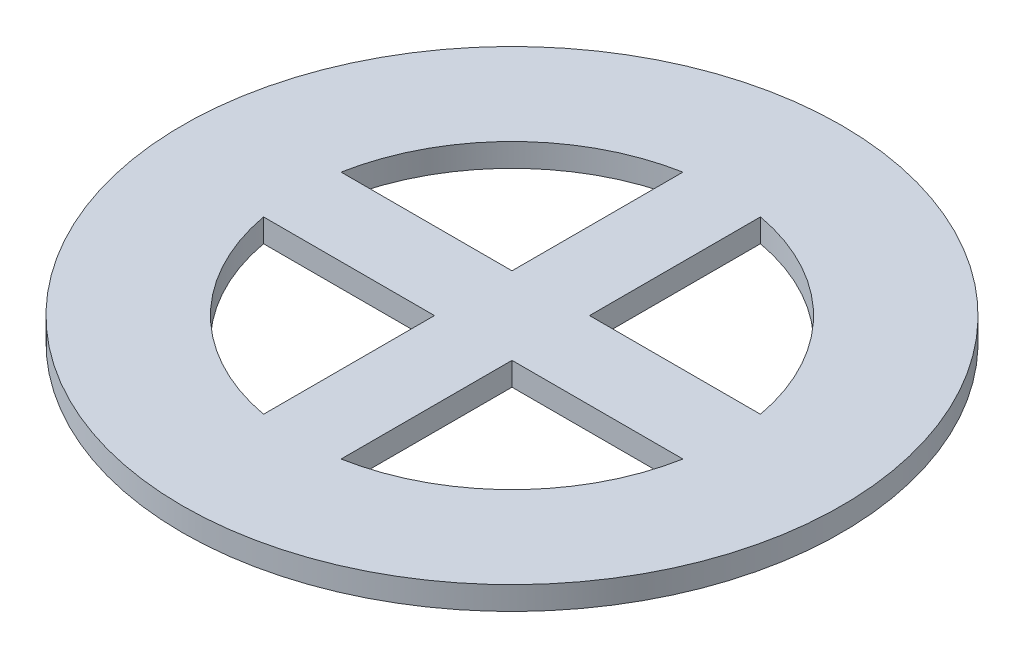
ISO-10303-21;
HEADER;
FILE_DESCRIPTION(('STEP AP214'),'2;1');
FILE_NAME('part.step','',(''),(''),'','','');
FILE_SCHEMA(('AUTOMOTIVE_DESIGN { 1 0 10303 214 1 1 1 1 }'));
ENDSEC;
DATA;
#1=APPLICATION_CONTEXT('core data for automotive mechanical design processes');
#2=APPLICATION_PROTOCOL_DEFINITION('international standard','automotive_design',2000,#1);
#3=PRODUCT_CONTEXT('',#1,'mechanical');
#4=PRODUCT('Part','Part','',(#3));
#5=PRODUCT_RELATED_PRODUCT_CATEGORY('part','',(#4));
#6=PRODUCT_DEFINITION_FORMATION('','',#4);
#7=PRODUCT_DEFINITION_CONTEXT('part definition',#1,'design');
#8=PRODUCT_DEFINITION('design','',#6,#7);
#9=PRODUCT_DEFINITION_SHAPE('','',#8);
#10=(LENGTH_UNIT() NAMED_UNIT(*) SI_UNIT(.MILLI.,.METRE.));
#11=(NAMED_UNIT(*) PLANE_ANGLE_UNIT() SI_UNIT($,.RADIAN.));
#12=(NAMED_UNIT(*) SI_UNIT($,.STERADIAN.) SOLID_ANGLE_UNIT());
#13=UNCERTAINTY_MEASURE_WITH_UNIT(LENGTH_MEASURE(1.E-05),#10,'distance_accuracy_value','');
#14=(GEOMETRIC_REPRESENTATION_CONTEXT(3) GLOBAL_UNCERTAINTY_ASSIGNED_CONTEXT((#13)) GLOBAL_UNIT_ASSIGNED_CONTEXT((#10,
#11,#12)) REPRESENTATION_CONTEXT('',''));
#15=CARTESIAN_POINT('',(0.,0.,0.));
#16=DIRECTION('',(0.,0.,1.));
#17=DIRECTION('',(1.,0.,0.));
#18=AXIS2_PLACEMENT_3D('',#15,#16,#17);
#19=CARTESIAN_POINT('',(-9.99999999999999,6.,0.));
#20=DIRECTION('',(1.,0.,0.));
#21=DIRECTION('',(0.,0.,-1.));
#22=AXIS2_PLACEMENT_3D('',#19,#20,#21);
#23=PLANE('',#22);
#24=DIRECTION('',(0.,0.,1.));
#25=VECTOR('',#24,1.);
#26=CARTESIAN_POINT('',(-9.99999999999999,0.,0.));
#27=LINE('',#26,#25);
#28=CARTESIAN_POINT('',(-10.,0.,-54.0832691319599));
#29=VERTEX_POINT('',#28);
#30=CARTESIAN_POINT('',(-9.99999999999999,0.,-10.));
#31=VERTEX_POINT('',#30);
#32=EDGE_CURVE('E142',#29,#31,#27,.T.);
#33=ORIENTED_EDGE('',*,*,#32,.T.);
#34=DIRECTION('',(0.,-1.,0.));
#35=VECTOR('',#34,1.);
#36=CARTESIAN_POINT('',(-9.99999999999999,6.,-10.));
#37=LINE('',#36,#35);
#38=CARTESIAN_POINT('',(-9.99999999999999,6.,-10.));
#39=VERTEX_POINT('',#38);
#40=EDGE_CURVE('E11',#39,#31,#37,.T.);
#41=ORIENTED_EDGE('',*,*,#40,.F.);
#42=DIRECTION('',(0.,0.,1.));
#43=VECTOR('',#42,1.);
#44=CARTESIAN_POINT('',(-9.99999999999999,6.,0.));
#45=LINE('',#44,#43);
#46=CARTESIAN_POINT('',(-10.,6.,-54.0832691319599));
#47=VERTEX_POINT('',#46);
#48=EDGE_CURVE('E133',#47,#39,#45,.T.);
#49=ORIENTED_EDGE('',*,*,#48,.F.);
#50=DIRECTION('',(0.,-1.,0.));
#51=VECTOR('',#50,1.);
#52=CARTESIAN_POINT('',(-10.,6.,-54.0832691319599));
#53=LINE('',#52,#51);
#54=EDGE_CURVE('E56',#47,#29,#53,.T.);
#55=ORIENTED_EDGE('',*,*,#54,.T.);
#56=EDGE_LOOP('',(#33,#41,#49,#55));
#57=FACE_BOUND('',#56,.T.);
#58=ADVANCED_FACE('F37',(#57),#23,.F.);
#59=CARTESIAN_POINT('',(0.,6.,-10.));
#60=DIRECTION('',(0.,0.,-1.));
#61=DIRECTION('',(-1.,0.,0.));
#62=AXIS2_PLACEMENT_3D('',#59,#60,#61);
#63=PLANE('',#62);
#64=DIRECTION('',(1.,0.,0.));
#65=VECTOR('',#64,1.);
#66=CARTESIAN_POINT('',(0.,0.,-10.));
#67=LINE('',#66,#65);
#68=CARTESIAN_POINT('',(-54.0832691319599,0.,-10.));
#69=VERTEX_POINT('',#68);
#70=EDGE_CURVE('E180',#69,#31,#67,.T.);
#71=ORIENTED_EDGE('',*,*,#70,.F.);
#72=DIRECTION('',(0.,-1.,0.));
#73=VECTOR('',#72,1.);
#74=CARTESIAN_POINT('',(-54.0832691319599,6.,-10.));
#75=LINE('',#74,#73);
#76=CARTESIAN_POINT('',(-54.0832691319599,6.,-10.));
#77=VERTEX_POINT('',#76);
#78=EDGE_CURVE('E47',#77,#69,#75,.T.);
#79=ORIENTED_EDGE('',*,*,#78,.F.);
#80=DIRECTION('',(1.,0.,0.));
#81=VECTOR('',#80,1.);
#82=CARTESIAN_POINT('',(0.,6.,-10.));
#83=LINE('',#82,#81);
#84=EDGE_CURVE('E138',#77,#39,#83,.T.);
#85=ORIENTED_EDGE('',*,*,#84,.T.);
#86=ORIENTED_EDGE('',*,*,#40,.T.);
#87=EDGE_LOOP('',(#71,#79,#85,#86));
#88=FACE_BOUND('',#87,.T.);
#89=ADVANCED_FACE('F145',(#88),#63,.T.);
#90=CARTESIAN_POINT('',(10.,6.,0.));
#91=DIRECTION('',(1.,0.,0.));
#92=DIRECTION('',(0.,0.,-1.));
#93=AXIS2_PLACEMENT_3D('',#90,#91,#92);
#94=PLANE('',#93);
#95=DIRECTION('',(0.,0.,1.));
#96=VECTOR('',#95,1.);
#97=CARTESIAN_POINT('',(10.,0.,0.));
#98=LINE('',#97,#96);
#99=CARTESIAN_POINT('',(10.,0.,10.));
#100=VERTEX_POINT('',#99);
#101=CARTESIAN_POINT('',(10.,0.,54.0832691319599));
#102=VERTEX_POINT('',#101);
#103=EDGE_CURVE('E172',#100,#102,#98,.T.);
#104=ORIENTED_EDGE('',*,*,#103,.F.);
#105=DIRECTION('',(0.,-1.,0.));
#106=VECTOR('',#105,1.);
#107=CARTESIAN_POINT('',(10.,6.,10.));
#108=LINE('',#107,#106);
#109=CARTESIAN_POINT('',(10.,6.,10.));
#110=VERTEX_POINT('',#109);
#111=EDGE_CURVE('E187',#110,#100,#108,.T.);
#112=ORIENTED_EDGE('',*,*,#111,.F.);
#113=DIRECTION('',(0.,0.,1.));
#114=VECTOR('',#113,1.);
#115=CARTESIAN_POINT('',(10.,6.,0.));
#116=LINE('',#115,#114);
#117=CARTESIAN_POINT('',(10.,6.,54.0832691319599));
#118=VERTEX_POINT('',#117);
#119=EDGE_CURVE('E224',#110,#118,#116,.T.);
#120=ORIENTED_EDGE('',*,*,#119,.T.);
#121=DIRECTION('',(0.,-1.,0.));
#122=VECTOR('',#121,1.);
#123=CARTESIAN_POINT('',(10.,6.,54.0832691319599));
#124=LINE('',#123,#122);
#125=EDGE_CURVE('E189',#118,#102,#124,.T.);
#126=ORIENTED_EDGE('',*,*,#125,.T.);
#127=EDGE_LOOP('',(#104,#112,#120,#126));
#128=FACE_BOUND('',#127,.T.);
#129=ADVANCED_FACE('F267',(#128),#94,.T.);
#130=CARTESIAN_POINT('',(0.,6.,10.));
#131=DIRECTION('',(0.,0.,-1.));
#132=DIRECTION('',(-1.,0.,0.));
#133=AXIS2_PLACEMENT_3D('',#130,#131,#132);
#134=PLANE('',#133);
#135=DIRECTION('',(1.,0.,0.));
#136=VECTOR('',#135,1.);
#137=CARTESIAN_POINT('',(0.,0.,10.));
#138=LINE('',#137,#136);
#139=CARTESIAN_POINT('',(54.0832691319599,0.,10.));
#140=VERTEX_POINT('',#139);
#141=EDGE_CURVE('E175',#100,#140,#138,.T.);
#142=ORIENTED_EDGE('',*,*,#141,.T.);
#143=DIRECTION('',(0.,-1.,0.));
#144=VECTOR('',#143,1.);
#145=CARTESIAN_POINT('',(54.0832691319599,6.,10.));
#146=LINE('',#145,#144);
#147=CARTESIAN_POINT('',(54.0832691319599,6.,10.));
#148=VERTEX_POINT('',#147);
#149=EDGE_CURVE('E191',#148,#140,#146,.T.);
#150=ORIENTED_EDGE('',*,*,#149,.F.);
#151=DIRECTION('',(1.,0.,0.));
#152=VECTOR('',#151,1.);
#153=CARTESIAN_POINT('',(0.,6.,10.));
#154=LINE('',#153,#152);
#155=EDGE_CURVE('E228',#110,#148,#154,.T.);
#156=ORIENTED_EDGE('',*,*,#155,.F.);
#157=ORIENTED_EDGE('',*,*,#111,.T.);
#158=EDGE_LOOP('',(#142,#150,#156,#157));
#159=FACE_BOUND('',#158,.T.);
#160=ADVANCED_FACE('F240',(#159),#134,.F.);
#161=CARTESIAN_POINT('',(0.,6.,-10.));
#162=DIRECTION('',(0.,0.,-1.));
#163=DIRECTION('',(-1.,0.,0.));
#164=AXIS2_PLACEMENT_3D('',#161,#162,#163);
#165=PLANE('',#164);
#166=DIRECTION('',(1.,0.,0.));
#167=VECTOR('',#166,1.);
#168=CARTESIAN_POINT('',(0.,0.,-10.));
#169=LINE('',#168,#167);
#170=CARTESIAN_POINT('',(10.,0.,-10.));
#171=VERTEX_POINT('',#170);
#172=CARTESIAN_POINT('',(54.0832691319599,0.,-10.));
#173=VERTEX_POINT('',#172);
#174=EDGE_CURVE('E164',#171,#173,#169,.T.);
#175=ORIENTED_EDGE('',*,*,#174,.F.);
#176=DIRECTION('',(0.,-1.,0.));
#177=VECTOR('',#176,1.);
#178=CARTESIAN_POINT('',(10.,6.,-10.));
#179=LINE('',#178,#177);
#180=CARTESIAN_POINT('',(10.,6.,-10.));
#181=VERTEX_POINT('',#180);
#182=EDGE_CURVE('E192',#181,#171,#179,.T.);
#183=ORIENTED_EDGE('',*,*,#182,.F.);
#184=DIRECTION('',(1.,0.,0.));
#185=VECTOR('',#184,1.);
#186=CARTESIAN_POINT('',(0.,6.,-10.));
#187=LINE('',#186,#185);
#188=CARTESIAN_POINT('',(54.0832691319599,6.,-10.));
#189=VERTEX_POINT('',#188);
#190=EDGE_CURVE('E217',#181,#189,#187,.T.);
#191=ORIENTED_EDGE('',*,*,#190,.T.);
#192=DIRECTION('',(0.,-1.,0.));
#193=VECTOR('',#192,1.);
#194=CARTESIAN_POINT('',(54.0832691319599,6.,-10.));
#195=LINE('',#194,#193);
#196=EDGE_CURVE('E195',#189,#173,#195,.T.);
#197=ORIENTED_EDGE('',*,*,#196,.T.);
#198=EDGE_LOOP('',(#175,#183,#191,#197));
#199=FACE_BOUND('',#198,.T.);
#200=ADVANCED_FACE('F271',(#199),#165,.T.);
#201=CARTESIAN_POINT('',(10.,6.,0.));
#202=DIRECTION('',(1.,0.,0.));
#203=DIRECTION('',(0.,0.,-1.));
#204=AXIS2_PLACEMENT_3D('',#201,#202,#203);
#205=PLANE('',#204);
#206=DIRECTION('',(0.,0.,1.));
#207=VECTOR('',#206,1.);
#208=CARTESIAN_POINT('',(10.,0.,0.));
#209=LINE('',#208,#207);
#210=CARTESIAN_POINT('',(10.,0.,-54.0832691319599));
#211=VERTEX_POINT('',#210);
#212=EDGE_CURVE('E169',#211,#171,#209,.T.);
#213=ORIENTED_EDGE('',*,*,#212,.F.);
#214=DIRECTION('',(0.,-1.,0.));
#215=VECTOR('',#214,1.);
#216=CARTESIAN_POINT('',(10.,6.,-54.0832691319599));
#217=LINE('',#216,#215);
#218=CARTESIAN_POINT('',(10.,6.,-54.0832691319599));
#219=VERTEX_POINT('',#218);
#220=EDGE_CURVE('E197',#219,#211,#217,.T.);
#221=ORIENTED_EDGE('',*,*,#220,.F.);
#222=DIRECTION('',(0.,0.,1.));
#223=VECTOR('',#222,1.);
#224=CARTESIAN_POINT('',(10.,6.,0.));
#225=LINE('',#224,#223);
#226=EDGE_CURVE('E220',#219,#181,#225,.T.);
#227=ORIENTED_EDGE('',*,*,#226,.T.);
#228=ORIENTED_EDGE('',*,*,#182,.T.);
#229=EDGE_LOOP('',(#213,#221,#227,#228));
#230=FACE_BOUND('',#229,.T.);
#231=ADVANCED_FACE('F275',(#230),#205,.T.);
#232=CARTESIAN_POINT('',(0.,6.,10.));
#233=DIRECTION('',(0.,0.,-1.));
#234=DIRECTION('',(-1.,0.,0.));
#235=AXIS2_PLACEMENT_3D('',#232,#233,#234);
#236=PLANE('',#235);
#237=DIRECTION('',(1.,0.,0.));
#238=VECTOR('',#237,1.);
#239=CARTESIAN_POINT('',(0.,0.,10.));
#240=LINE('',#239,#238);
#241=CARTESIAN_POINT('',(-54.0832691319599,0.,10.));
#242=VERTEX_POINT('',#241);
#243=CARTESIAN_POINT('',(-9.99999999999999,0.,10.));
#244=VERTEX_POINT('',#243);
#245=EDGE_CURVE('E155',#242,#244,#240,.T.);
#246=ORIENTED_EDGE('',*,*,#245,.T.);
#247=DIRECTION('',(0.,-1.,0.));
#248=VECTOR('',#247,1.);
#249=CARTESIAN_POINT('',(-9.99999999999999,6.,10.));
#250=LINE('',#249,#248);
#251=CARTESIAN_POINT('',(-9.99999999999999,6.,10.));
#252=VERTEX_POINT('',#251);
#253=EDGE_CURVE('E41',#252,#244,#250,.T.);
#254=ORIENTED_EDGE('',*,*,#253,.F.);
#255=DIRECTION('',(1.,0.,0.));
#256=VECTOR('',#255,1.);
#257=CARTESIAN_POINT('',(0.,6.,10.));
#258=LINE('',#257,#256);
#259=CARTESIAN_POINT('',(-54.0832691319599,6.,10.));
#260=VERTEX_POINT('',#259);
#261=EDGE_CURVE('E185',#260,#252,#258,.T.);
#262=ORIENTED_EDGE('',*,*,#261,.F.);
#263=DIRECTION('',(0.,-1.,0.));
#264=VECTOR('',#263,1.);
#265=CARTESIAN_POINT('',(-54.0832691319599,6.,10.));
#266=LINE('',#265,#264);
#267=EDGE_CURVE('E154',#260,#242,#266,.T.);
#268=ORIENTED_EDGE('',*,*,#267,.T.);
#269=EDGE_LOOP('',(#246,#254,#262,#268));
#270=FACE_BOUND('',#269,.T.);
#271=ADVANCED_FACE('F39',(#270),#236,.F.);
#272=CARTESIAN_POINT('',(-9.99999999999999,6.,0.));
#273=DIRECTION('',(1.,0.,0.));
#274=DIRECTION('',(0.,0.,-1.));
#275=AXIS2_PLACEMENT_3D('',#272,#273,#274);
#276=PLANE('',#275);
#277=DIRECTION('',(0.,0.,1.));
#278=VECTOR('',#277,1.);
#279=CARTESIAN_POINT('',(-9.99999999999999,0.,0.));
#280=LINE('',#279,#278);
#281=CARTESIAN_POINT('',(-9.99999999999999,0.,54.0832691319599));
#282=VERTEX_POINT('',#281);
#283=EDGE_CURVE('E158',#244,#282,#280,.T.);
#284=ORIENTED_EDGE('',*,*,#283,.T.);
#285=DIRECTION('',(0.,-1.,0.));
#286=VECTOR('',#285,1.);
#287=CARTESIAN_POINT('',(-9.99999999999999,6.,54.0832691319599));
#288=LINE('',#287,#286);
#289=CARTESIAN_POINT('',(-9.99999999999999,6.,54.0832691319599));
#290=VERTEX_POINT('',#289);
#291=EDGE_CURVE('E200',#290,#282,#288,.T.);
#292=ORIENTED_EDGE('',*,*,#291,.F.);
#293=DIRECTION('',(0.,0.,1.));
#294=VECTOR('',#293,1.);
#295=CARTESIAN_POINT('',(-9.99999999999999,6.,0.));
#296=LINE('',#295,#294);
#297=EDGE_CURVE('E105',#252,#290,#296,.T.);
#298=ORIENTED_EDGE('',*,*,#297,.F.);
#299=ORIENTED_EDGE('',*,*,#253,.T.);
#300=EDGE_LOOP('',(#284,#292,#298,#299));
#301=FACE_BOUND('',#300,.T.);
#302=ADVANCED_FACE('F205',(#301),#276,.F.);
#303=CARTESIAN_POINT('',(0.,6.,0.));
#304=DIRECTION('',(0.,-1.,0.));
#305=DIRECTION('',(0.,0.,-1.));
#306=AXIS2_PLACEMENT_3D('',#303,#304,#305);
#307=CYLINDRICAL_SURFACE('',#306,55.);
#308=CARTESIAN_POINT('',(0.,0.,0.));
#309=DIRECTION('',(0.,1.,0.));
#310=DIRECTION('',(0.,0.,1.));
#311=AXIS2_PLACEMENT_3D('',#308,#309,#310);
#312=CIRCLE('',#311,55.);
#313=EDGE_CURVE('E165',#29,#69,#312,.T.);
#314=ORIENTED_EDGE('',*,*,#313,.F.);
#315=ORIENTED_EDGE('',*,*,#54,.F.);
#316=CARTESIAN_POINT('',(0.,6.,0.));
#317=DIRECTION('',(0.,1.,0.));
#318=DIRECTION('',(0.,0.,1.));
#319=AXIS2_PLACEMENT_3D('',#316,#317,#318);
#320=CIRCLE('',#319,55.);
#321=EDGE_CURVE('E139',#47,#77,#320,.T.);
#322=ORIENTED_EDGE('',*,*,#321,.T.);
#323=ORIENTED_EDGE('',*,*,#78,.T.);
#324=EDGE_LOOP('',(#314,#315,#322,#323));
#325=FACE_BOUND('',#324,.T.);
#326=ADVANCED_FACE('F250',(#325),#307,.F.);
#327=EDGE_CURVE('E178',#102,#140,#312,.T.);
#328=ORIENTED_EDGE('',*,*,#327,.F.);
#329=ORIENTED_EDGE('',*,*,#125,.F.);
#330=EDGE_CURVE('E140',#118,#148,#320,.T.);
#331=ORIENTED_EDGE('',*,*,#330,.T.);
#332=ORIENTED_EDGE('',*,*,#149,.T.);
#333=EDGE_LOOP('',(#328,#329,#331,#332));
#334=FACE_BOUND('',#333,.T.);
#335=ADVANCED_FACE('F244',(#334),#307,.F.);
#336=EDGE_CURVE('E166',#173,#211,#312,.T.);
#337=ORIENTED_EDGE('',*,*,#336,.F.);
#338=ORIENTED_EDGE('',*,*,#196,.F.);
#339=EDGE_CURVE('E218',#189,#219,#320,.T.);
#340=ORIENTED_EDGE('',*,*,#339,.T.);
#341=ORIENTED_EDGE('',*,*,#220,.T.);
#342=EDGE_LOOP('',(#337,#338,#340,#341));
#343=FACE_BOUND('',#342,.T.);
#344=ADVANCED_FACE('F257',(#343),#307,.F.);
#345=EDGE_CURVE('E161',#242,#282,#312,.T.);
#346=ORIENTED_EDGE('',*,*,#345,.F.);
#347=ORIENTED_EDGE('',*,*,#267,.F.);
#348=EDGE_CURVE('E149',#260,#290,#320,.T.);
#349=ORIENTED_EDGE('',*,*,#348,.T.);
#350=ORIENTED_EDGE('',*,*,#291,.T.);
#351=EDGE_LOOP('',(#346,#347,#349,#350));
#352=FACE_BOUND('',#351,.T.);
#353=ADVANCED_FACE('F212',(#352),#307,.F.);
#354=CARTESIAN_POINT('',(0.,6.,0.));
#355=DIRECTION('',(0.,-1.,0.));
#356=DIRECTION('',(0.,0.,-1.));
#357=AXIS2_PLACEMENT_3D('',#354,#355,#356);
#358=CYLINDRICAL_SURFACE('',#357,85.);
#359=CARTESIAN_POINT('',(0.,6.,0.));
#360=DIRECTION('',(0.,1.,0.));
#361=DIRECTION('',(0.,0.,1.));
#362=AXIS2_PLACEMENT_3D('',#359,#360,#361);
#363=CIRCLE('',#362,85.);
#364=CARTESIAN_POINT('',(0.,6.,85.));
#365=VERTEX_POINT('',#364);
#366=EDGE_CURVE('E147',#365,#365,#363,.T.);
#367=ORIENTED_EDGE('',*,*,#366,.F.);
#368=EDGE_LOOP('',(#367));
#369=FACE_BOUND('',#368,.T.);
#370=CARTESIAN_POINT('',(0.,0.,0.));
#371=DIRECTION('',(0.,1.,0.));
#372=DIRECTION('',(0.,0.,1.));
#373=AXIS2_PLACEMENT_3D('',#370,#371,#372);
#374=CIRCLE('',#373,85.);
#375=CARTESIAN_POINT('',(0.,0.,85.));
#376=VERTEX_POINT('',#375);
#377=EDGE_CURVE('E182',#376,#376,#374,.T.);
#378=ORIENTED_EDGE('',*,*,#377,.T.);
#379=EDGE_LOOP('',(#378));
#380=FACE_BOUND('',#379,.T.);
#381=ADVANCED_FACE('F261',(#369,#380),#358,.T.);
#382=CARTESIAN_POINT('',(0.,6.,0.));
#383=DIRECTION('',(0.,1.,0.));
#384=DIRECTION('',(0.,0.,1.));
#385=AXIS2_PLACEMENT_3D('',#382,#383,#384);
#386=PLANE('',#385);
#387=ORIENTED_EDGE('',*,*,#261,.T.);
#388=ORIENTED_EDGE('',*,*,#297,.T.);
#389=ORIENTED_EDGE('',*,*,#348,.F.);
#390=EDGE_LOOP('',(#387,#388,#389));
#391=FACE_BOUND('',#390,.T.);
#392=ORIENTED_EDGE('',*,*,#190,.F.);
#393=ORIENTED_EDGE('',*,*,#226,.F.);
#394=ORIENTED_EDGE('',*,*,#339,.F.);
#395=EDGE_LOOP('',(#392,#393,#394));
#396=FACE_BOUND('',#395,.T.);
#397=ORIENTED_EDGE('',*,*,#119,.F.);
#398=ORIENTED_EDGE('',*,*,#155,.T.);
#399=ORIENTED_EDGE('',*,*,#330,.F.);
#400=EDGE_LOOP('',(#397,#398,#399));
#401=FACE_BOUND('',#400,.T.);
#402=ORIENTED_EDGE('',*,*,#48,.T.);
#403=ORIENTED_EDGE('',*,*,#84,.F.);
#404=ORIENTED_EDGE('',*,*,#321,.F.);
#405=EDGE_LOOP('',(#402,#403,#404));
#406=FACE_BOUND('',#405,.T.);
#407=ORIENTED_EDGE('',*,*,#366,.T.);
#408=EDGE_LOOP('',(#407));
#409=FACE_BOUND('',#408,.T.);
#410=ADVANCED_FACE('F135',(#391,#396,#401,#406,#409),#386,.T.);
#411=CARTESIAN_POINT('',(0.,0.,0.));
#412=DIRECTION('',(0.,1.,0.));
#413=DIRECTION('',(0.,0.,1.));
#414=AXIS2_PLACEMENT_3D('',#411,#412,#413);
#415=PLANE('',#414);
#416=ORIENTED_EDGE('',*,*,#245,.F.);
#417=ORIENTED_EDGE('',*,*,#345,.T.);
#418=ORIENTED_EDGE('',*,*,#283,.F.);
#419=EDGE_LOOP('',(#416,#417,#418));
#420=FACE_BOUND('',#419,.T.);
#421=ORIENTED_EDGE('',*,*,#174,.T.);
#422=ORIENTED_EDGE('',*,*,#336,.T.);
#423=ORIENTED_EDGE('',*,*,#212,.T.);
#424=EDGE_LOOP('',(#421,#422,#423));
#425=FACE_BOUND('',#424,.T.);
#426=ORIENTED_EDGE('',*,*,#103,.T.);
#427=ORIENTED_EDGE('',*,*,#327,.T.);
#428=ORIENTED_EDGE('',*,*,#141,.F.);
#429=EDGE_LOOP('',(#426,#427,#428));
#430=FACE_BOUND('',#429,.T.);
#431=ORIENTED_EDGE('',*,*,#32,.F.);
#432=ORIENTED_EDGE('',*,*,#313,.T.);
#433=ORIENTED_EDGE('',*,*,#70,.T.);
#434=EDGE_LOOP('',(#431,#432,#433));
#435=FACE_BOUND('',#434,.T.);
#436=ORIENTED_EDGE('',*,*,#377,.F.);
#437=EDGE_LOOP('',(#436));
#438=FACE_BOUND('',#437,.T.);
#439=ADVANCED_FACE('F210',(#420,#425,#430,#435,#438),#415,.F.);
#440=CLOSED_SHELL('',(#58,#89,#129,#160,#200,#231,#271,#302,#326,#335,#344,#353,#381,#410,#439));
#441=MANIFOLD_SOLID_BREP('B2',#440);
#442=ADVANCED_BREP_SHAPE_REPRESENTATION('',(#18,#441),#14);
#443=SHAPE_DEFINITION_REPRESENTATION(#9,#442);
ENDSEC;
END-ISO-10303-21;
